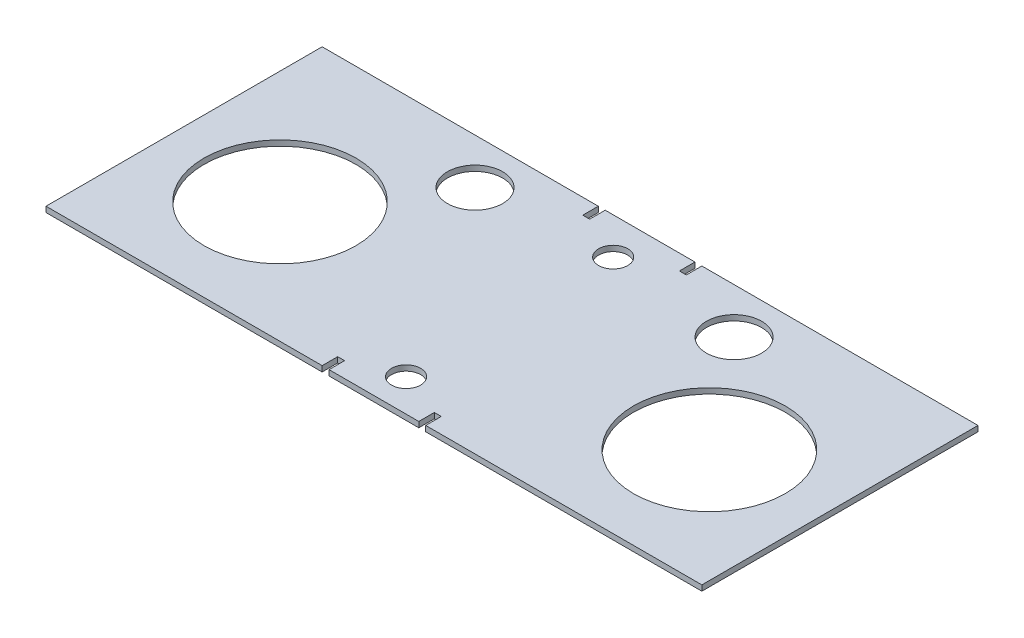
ISO-10303-21;
HEADER;
FILE_DESCRIPTION(('STEP AP214'),'2;1');
FILE_NAME('part.step','',(''),(''),'','','');
FILE_SCHEMA(('AUTOMOTIVE_DESIGN { 1 0 10303 214 1 1 1 1 }'));
ENDSEC;
DATA;
#1=APPLICATION_CONTEXT('core data for automotive mechanical design processes');
#2=APPLICATION_PROTOCOL_DEFINITION('international standard','automotive_design',2000,#1);
#3=PRODUCT_CONTEXT('',#1,'mechanical');
#4=PRODUCT('Part','Part','',(#3));
#5=PRODUCT_RELATED_PRODUCT_CATEGORY('part','',(#4));
#6=PRODUCT_DEFINITION_FORMATION('','',#4);
#7=PRODUCT_DEFINITION_CONTEXT('part definition',#1,'design');
#8=PRODUCT_DEFINITION('design','',#6,#7);
#9=PRODUCT_DEFINITION_SHAPE('','',#8);
#10=(LENGTH_UNIT() NAMED_UNIT(*) SI_UNIT(.MILLI.,.METRE.));
#11=(NAMED_UNIT(*) PLANE_ANGLE_UNIT() SI_UNIT($,.RADIAN.));
#12=(NAMED_UNIT(*) SI_UNIT($,.STERADIAN.) SOLID_ANGLE_UNIT());
#13=UNCERTAINTY_MEASURE_WITH_UNIT(LENGTH_MEASURE(1.E-05),#10,'distance_accuracy_value','');
#14=(GEOMETRIC_REPRESENTATION_CONTEXT(3) GLOBAL_UNCERTAINTY_ASSIGNED_CONTEXT((#13)) GLOBAL_UNIT_ASSIGNED_CONTEXT((#10,
#11,#12)) REPRESENTATION_CONTEXT('',''));
#15=CARTESIAN_POINT('',(0.,0.,0.));
#16=DIRECTION('',(0.,0.,1.));
#17=DIRECTION('',(1.,0.,0.));
#18=AXIS2_PLACEMENT_3D('',#15,#16,#17);
#19=CARTESIAN_POINT('',(0.,0.,0.));
#20=DIRECTION('',(0.,-1.,0.));
#21=DIRECTION('',(0.,0.,-1.));
#22=AXIS2_PLACEMENT_3D('',#19,#20,#21);
#23=PLANE('',#22);
#24=CARTESIAN_POINT('',(-0.0345900831630885,0.,-14.6910048312869));
#25=DIRECTION('',(0.,-1.,0.));
#26=DIRECTION('',(0.,0.,-1.));
#27=AXIS2_PLACEMENT_3D('',#24,#25,#26);
#28=CIRCLE('',#27,2.10819999999998);
#29=CARTESIAN_POINT('',(-0.0345900831630885,0.,-16.7992048312868));
#30=VERTEX_POINT('',#29);
#31=EDGE_CURVE('E315',#30,#30,#28,.T.);
#32=ORIENTED_EDGE('',*,*,#31,.T.);
#33=EDGE_LOOP('',(#32));
#34=FACE_BOUND('',#33,.T.);
#35=CARTESIAN_POINT('',(-0.0345900831630747,0.,15.3089951687131));
#36=DIRECTION('',(0.,-1.,0.));
#37=DIRECTION('',(0.,0.,-1.));
#38=AXIS2_PLACEMENT_3D('',#35,#36,#37);
#39=CIRCLE('',#38,2.10819999999998);
#40=CARTESIAN_POINT('',(-0.0345900831630747,0.,13.2007951687132));
#41=VERTEX_POINT('',#40);
#42=EDGE_CURVE('E321',#41,#41,#39,.T.);
#43=ORIENTED_EDGE('',*,*,#42,.T.);
#44=EDGE_LOOP('',(#43));
#45=FACE_BOUND('',#44,.T.);
#46=DIRECTION('',(0.,0.,-1.));
#47=VECTOR('',#46,1.);
#48=CARTESIAN_POINT('',(-6.5,0.,-17.75));
#49=LINE('',#48,#47);
#50=CARTESIAN_POINT('',(-6.5,0.,-17.75));
#51=VERTEX_POINT('',#50);
#52=CARTESIAN_POINT('',(-6.5,0.,-20.));
#53=VERTEX_POINT('',#52);
#54=EDGE_CURVE('E328',#51,#53,#49,.T.);
#55=ORIENTED_EDGE('',*,*,#54,.F.);
#56=DIRECTION('',(1.,0.,0.));
#57=VECTOR('',#56,1.);
#58=CARTESIAN_POINT('',(-7.59955742875643,0.,-17.75));
#59=LINE('',#58,#57);
#60=CARTESIAN_POINT('',(-7.5,0.,-17.75));
#61=VERTEX_POINT('',#60);
#62=EDGE_CURVE('E69',#61,#51,#59,.T.);
#63=ORIENTED_EDGE('',*,*,#62,.F.);
#64=DIRECTION('',(0.,0.,-1.));
#65=VECTOR('',#64,1.);
#66=CARTESIAN_POINT('',(-7.5,0.,0.));
#67=LINE('',#66,#65);
#68=CARTESIAN_POINT('',(-7.5,0.,-20.));
#69=VERTEX_POINT('',#68);
#70=EDGE_CURVE('E291',#69,#61,#67,.F.);
#71=ORIENTED_EDGE('',*,*,#70,.F.);
#72=DIRECTION('',(1.,0.,0.));
#73=VECTOR('',#72,1.);
#74=CARTESIAN_POINT('',(-7.59955742875643,0.,-20.));
#75=LINE('',#74,#73);
#76=CARTESIAN_POINT('',(-47.5,0.,-20.));
#77=VERTEX_POINT('',#76);
#78=EDGE_CURVE('E294',#77,#69,#75,.T.);
#79=ORIENTED_EDGE('',*,*,#78,.F.);
#80=DIRECTION('',(0.,0.,1.));
#81=VECTOR('',#80,1.);
#82=CARTESIAN_POINT('',(-47.5,0.,20.));
#83=LINE('',#82,#81);
#84=CARTESIAN_POINT('',(-47.5,0.,20.));
#85=VERTEX_POINT('',#84);
#86=EDGE_CURVE('E253',#77,#85,#83,.T.);
#87=ORIENTED_EDGE('',*,*,#86,.T.);
#88=DIRECTION('',(1.,0.,0.));
#89=VECTOR('',#88,1.);
#90=CARTESIAN_POINT('',(-7.59955742875643,0.,20.));
#91=LINE('',#90,#89);
#92=CARTESIAN_POINT('',(-7.5,0.,20.));
#93=VERTEX_POINT('',#92);
#94=EDGE_CURVE('E297',#93,#85,#91,.F.);
#95=ORIENTED_EDGE('',*,*,#94,.F.);
#96=DIRECTION('',(0.,0.,-1.));
#97=VECTOR('',#96,1.);
#98=CARTESIAN_POINT('',(-7.5,0.,0.));
#99=LINE('',#98,#97);
#100=CARTESIAN_POINT('',(-7.5,0.,17.75));
#101=VERTEX_POINT('',#100);
#102=EDGE_CURVE('E299',#101,#93,#99,.F.);
#103=ORIENTED_EDGE('',*,*,#102,.F.);
#104=DIRECTION('',(1.,0.,0.));
#105=VECTOR('',#104,1.);
#106=CARTESIAN_POINT('',(-7.59955742875643,0.,17.75));
#107=LINE('',#106,#105);
#108=CARTESIAN_POINT('',(-6.5,0.,17.75));
#109=VERTEX_POINT('',#108);
#110=EDGE_CURVE('E252',#109,#101,#107,.F.);
#111=ORIENTED_EDGE('',*,*,#110,.F.);
#112=DIRECTION('',(0.,0.,1.));
#113=VECTOR('',#112,1.);
#114=CARTESIAN_POINT('',(-6.5,0.,0.));
#115=LINE('',#114,#113);
#116=CARTESIAN_POINT('',(-6.5,0.,20.));
#117=VERTEX_POINT('',#116);
#118=EDGE_CURVE('E353',#109,#117,#115,.T.);
#119=ORIENTED_EDGE('',*,*,#118,.T.);
#120=DIRECTION('',(1.,0.,0.));
#121=VECTOR('',#120,1.);
#122=CARTESIAN_POINT('',(-47.5,0.,20.));
#123=LINE('',#122,#121);
#124=CARTESIAN_POINT('',(6.50000000000001,0.,20.));
#125=VERTEX_POINT('',#124);
#126=EDGE_CURVE('E361',#117,#125,#123,.T.);
#127=ORIENTED_EDGE('',*,*,#126,.T.);
#128=DIRECTION('',(0.,0.,1.));
#129=VECTOR('',#128,1.);
#130=CARTESIAN_POINT('',(6.50000000000001,0.,22.25));
#131=LINE('',#130,#129);
#132=CARTESIAN_POINT('',(6.50000000000001,0.,17.75));
#133=VERTEX_POINT('',#132);
#134=EDGE_CURVE('E335',#133,#125,#131,.T.);
#135=ORIENTED_EDGE('',*,*,#134,.F.);
#136=DIRECTION('',(1.,0.,0.));
#137=VECTOR('',#136,1.);
#138=CARTESIAN_POINT('',(7.59955742875644,0.,17.75));
#139=LINE('',#138,#137);
#140=CARTESIAN_POINT('',(7.50000000000001,0.,17.75));
#141=VERTEX_POINT('',#140);
#142=EDGE_CURVE('E61',#141,#133,#139,.F.);
#143=ORIENTED_EDGE('',*,*,#142,.F.);
#144=DIRECTION('',(0.,0.,-1.));
#145=VECTOR('',#144,1.);
#146=CARTESIAN_POINT('',(7.50000000000001,0.,0.));
#147=LINE('',#146,#145);
#148=CARTESIAN_POINT('',(7.50000000000001,0.,20.));
#149=VERTEX_POINT('',#148);
#150=EDGE_CURVE('E229',#149,#141,#147,.T.);
#151=ORIENTED_EDGE('',*,*,#150,.F.);
#152=DIRECTION('',(1.,0.,0.));
#153=VECTOR('',#152,1.);
#154=CARTESIAN_POINT('',(7.59955742875644,0.,20.));
#155=LINE('',#154,#153);
#156=CARTESIAN_POINT('',(47.5,0.,20.));
#157=VERTEX_POINT('',#156);
#158=EDGE_CURVE('E232',#157,#149,#155,.F.);
#159=ORIENTED_EDGE('',*,*,#158,.F.);
#160=DIRECTION('',(0.,0.,-1.));
#161=VECTOR('',#160,1.);
#162=CARTESIAN_POINT('',(47.5,0.,20.));
#163=LINE('',#162,#161);
#164=CARTESIAN_POINT('',(47.5,0.,-20.));
#165=VERTEX_POINT('',#164);
#166=EDGE_CURVE('E203',#157,#165,#163,.T.);
#167=ORIENTED_EDGE('',*,*,#166,.T.);
#168=DIRECTION('',(1.,0.,0.));
#169=VECTOR('',#168,1.);
#170=CARTESIAN_POINT('',(7.59955742875644,0.,-20.));
#171=LINE('',#170,#169);
#172=CARTESIAN_POINT('',(7.5,0.,-20.));
#173=VERTEX_POINT('',#172);
#174=EDGE_CURVE('E234',#173,#165,#171,.T.);
#175=ORIENTED_EDGE('',*,*,#174,.F.);
#176=DIRECTION('',(0.,0.,-1.));
#177=VECTOR('',#176,1.);
#178=CARTESIAN_POINT('',(7.5,0.,0.));
#179=LINE('',#178,#177);
#180=CARTESIAN_POINT('',(7.5,0.,-17.75));
#181=VERTEX_POINT('',#180);
#182=EDGE_CURVE('E236',#181,#173,#179,.T.);
#183=ORIENTED_EDGE('',*,*,#182,.F.);
#184=DIRECTION('',(1.,0.,0.));
#185=VECTOR('',#184,1.);
#186=CARTESIAN_POINT('',(7.59955742875644,0.,-17.75));
#187=LINE('',#186,#185);
#188=CARTESIAN_POINT('',(6.50000000000001,0.,-17.75));
#189=VERTEX_POINT('',#188);
#190=EDGE_CURVE('E204',#189,#181,#187,.T.);
#191=ORIENTED_EDGE('',*,*,#190,.F.);
#192=DIRECTION('',(0.,0.,-1.));
#193=VECTOR('',#192,1.);
#194=CARTESIAN_POINT('',(6.5,0.,0.));
#195=LINE('',#194,#193);
#196=CARTESIAN_POINT('',(6.5,0.,-20.));
#197=VERTEX_POINT('',#196);
#198=EDGE_CURVE('E350',#189,#197,#195,.T.);
#199=ORIENTED_EDGE('',*,*,#198,.T.);
#200=DIRECTION('',(-1.,0.,0.));
#201=VECTOR('',#200,1.);
#202=CARTESIAN_POINT('',(-47.5,0.,-20.));
#203=LINE('',#202,#201);
#204=EDGE_CURVE('E349',#197,#53,#203,.T.);
#205=ORIENTED_EDGE('',*,*,#204,.T.);
#206=EDGE_LOOP('',(#55,#63,#71,#79,#87,#95,#103,#111,#119,#127,#135,#143,#151,#159,#167,#175,
#183,#191,#199,#205));
#207=FACE_BOUND('',#206,.T.);
#208=CARTESIAN_POINT('',(-31.0972644046002,0.,2.50699135743875));
#209=DIRECTION('',(0.,-1.,0.));
#210=DIRECTION('',(1.,0.,0.));
#211=AXIS2_PLACEMENT_3D('',#208,#209,#210);
#212=CIRCLE('',#211,11.);
#213=CARTESIAN_POINT('',(-20.0972644046002,0.,2.50699135743875));
#214=VERTEX_POINT('',#213);
#215=EDGE_CURVE('E259',#214,#214,#212,.T.);
#216=ORIENTED_EDGE('',*,*,#215,.T.);
#217=EDGE_LOOP('',(#216));
#218=FACE_BOUND('',#217,.T.);
#219=CARTESIAN_POINT('',(-18.7592276804298,0.,-13.4035690974526));
#220=DIRECTION('',(0.,-1.,0.));
#221=DIRECTION('',(1.,0.,0.));
#222=AXIS2_PLACEMENT_3D('',#219,#220,#221);
#223=CIRCLE('',#222,3.99999999999999);
#224=CARTESIAN_POINT('',(-14.7592276804298,0.,-13.4035690974526));
#225=VERTEX_POINT('',#224);
#226=EDGE_CURVE('E256',#225,#225,#223,.T.);
#227=ORIENTED_EDGE('',*,*,#226,.T.);
#228=EDGE_LOOP('',(#227));
#229=FACE_BOUND('',#228,.T.);
#230=CARTESIAN_POINT('',(31.0972644046002,0.,2.50699135743875));
#231=DIRECTION('',(0.,-1.,0.));
#232=DIRECTION('',(1.,0.,0.));
#233=AXIS2_PLACEMENT_3D('',#230,#231,#232);
#234=CIRCLE('',#233,11.);
#235=CARTESIAN_POINT('',(42.0972644046002,0.,2.50699135743875));
#236=VERTEX_POINT('',#235);
#237=EDGE_CURVE('E431',#236,#236,#234,.T.);
#238=ORIENTED_EDGE('',*,*,#237,.T.);
#239=EDGE_LOOP('',(#238));
#240=FACE_BOUND('',#239,.T.);
#241=CARTESIAN_POINT('',(18.7592276804298,0.,-13.4035690974526));
#242=DIRECTION('',(0.,-1.,0.));
#243=DIRECTION('',(1.,0.,0.));
#244=AXIS2_PLACEMENT_3D('',#241,#242,#243);
#245=CIRCLE('',#244,3.99999999999999);
#246=CARTESIAN_POINT('',(22.7592276804298,0.,-13.4035690974526));
#247=VERTEX_POINT('',#246);
#248=EDGE_CURVE('E428',#247,#247,#245,.T.);
#249=ORIENTED_EDGE('',*,*,#248,.T.);
#250=EDGE_LOOP('',(#249));
#251=FACE_BOUND('',#250,.T.);
#252=ADVANCED_FACE('F47',(#34,#45,#207,#218,#229,#240,#251),#23,.F.);
#253=CARTESIAN_POINT('',(0.,-0.8,0.));
#254=DIRECTION('',(0.,-1.,0.));
#255=DIRECTION('',(0.,0.,-1.));
#256=AXIS2_PLACEMENT_3D('',#253,#254,#255);
#257=PLANE('',#256);
#258=CARTESIAN_POINT('',(-0.0345900831630885,-0.8,-14.6910048312869));
#259=DIRECTION('',(0.,-1.,0.));
#260=DIRECTION('',(0.,0.,-1.));
#261=AXIS2_PLACEMENT_3D('',#258,#259,#260);
#262=CIRCLE('',#261,2.10819999999999);
#263=CARTESIAN_POINT('',(-0.0345900831630885,-0.8,-16.7992048312868));
#264=VERTEX_POINT('',#263);
#265=EDGE_CURVE('E311',#264,#264,#262,.T.);
#266=ORIENTED_EDGE('',*,*,#265,.F.);
#267=EDGE_LOOP('',(#266));
#268=FACE_BOUND('',#267,.T.);
#269=CARTESIAN_POINT('',(-0.0345900831630747,-0.8,15.3089951687131));
#270=DIRECTION('',(0.,-1.,0.));
#271=DIRECTION('',(0.,0.,-1.));
#272=AXIS2_PLACEMENT_3D('',#269,#270,#271);
#273=CIRCLE('',#272,2.10819999999999);
#274=CARTESIAN_POINT('',(-0.0345900831630747,-0.8,13.2007951687132));
#275=VERTEX_POINT('',#274);
#276=EDGE_CURVE('E318',#275,#275,#273,.T.);
#277=ORIENTED_EDGE('',*,*,#276,.F.);
#278=EDGE_LOOP('',(#277));
#279=FACE_BOUND('',#278,.T.);
#280=DIRECTION('',(0.,0.,-1.));
#281=VECTOR('',#280,1.);
#282=CARTESIAN_POINT('',(-6.5,-0.8,22.25));
#283=LINE('',#282,#281);
#284=CARTESIAN_POINT('',(-6.5,-0.8,20.));
#285=VERTEX_POINT('',#284);
#286=CARTESIAN_POINT('',(-6.5,-0.8,17.75));
#287=VERTEX_POINT('',#286);
#288=EDGE_CURVE('E324',#285,#287,#283,.T.);
#289=ORIENTED_EDGE('',*,*,#288,.T.);
#290=DIRECTION('',(1.,0.,0.));
#291=VECTOR('',#290,1.);
#292=CARTESIAN_POINT('',(-7.59955742875643,-0.8,17.75));
#293=LINE('',#292,#291);
#294=CARTESIAN_POINT('',(-7.5,-0.8,17.75));
#295=VERTEX_POINT('',#294);
#296=EDGE_CURVE('E285',#287,#295,#293,.F.);
#297=ORIENTED_EDGE('',*,*,#296,.T.);
#298=DIRECTION('',(0.,0.,-1.));
#299=VECTOR('',#298,1.);
#300=CARTESIAN_POINT('',(-7.5,-0.8,0.));
#301=LINE('',#300,#299);
#302=CARTESIAN_POINT('',(-7.5,-0.8,20.));
#303=VERTEX_POINT('',#302);
#304=EDGE_CURVE('E282',#295,#303,#301,.F.);
#305=ORIENTED_EDGE('',*,*,#304,.T.);
#306=DIRECTION('',(1.,0.,0.));
#307=VECTOR('',#306,1.);
#308=CARTESIAN_POINT('',(-7.59955742875643,-0.8,20.));
#309=LINE('',#308,#307);
#310=CARTESIAN_POINT('',(-47.5,-0.8,20.));
#311=VERTEX_POINT('',#310);
#312=EDGE_CURVE('E280',#303,#311,#309,.F.);
#313=ORIENTED_EDGE('',*,*,#312,.T.);
#314=DIRECTION('',(0.,0.,1.));
#315=VECTOR('',#314,1.);
#316=CARTESIAN_POINT('',(-47.5,-0.8,20.));
#317=LINE('',#316,#315);
#318=CARTESIAN_POINT('',(-47.5,-0.8,-20.));
#319=VERTEX_POINT('',#318);
#320=EDGE_CURVE('E247',#319,#311,#317,.T.);
#321=ORIENTED_EDGE('',*,*,#320,.F.);
#322=DIRECTION('',(1.,0.,0.));
#323=VECTOR('',#322,1.);
#324=CARTESIAN_POINT('',(-7.59955742875643,-0.8,-20.));
#325=LINE('',#324,#323);
#326=CARTESIAN_POINT('',(-7.5,-0.8,-20.));
#327=VERTEX_POINT('',#326);
#328=EDGE_CURVE('E277',#319,#327,#325,.T.);
#329=ORIENTED_EDGE('',*,*,#328,.T.);
#330=DIRECTION('',(0.,0.,-1.));
#331=VECTOR('',#330,1.);
#332=CARTESIAN_POINT('',(-7.5,-0.8,0.));
#333=LINE('',#332,#331);
#334=CARTESIAN_POINT('',(-7.5,-0.8,-17.75));
#335=VERTEX_POINT('',#334);
#336=EDGE_CURVE('E273',#327,#335,#333,.F.);
#337=ORIENTED_EDGE('',*,*,#336,.T.);
#338=DIRECTION('',(1.,0.,0.));
#339=VECTOR('',#338,1.);
#340=CARTESIAN_POINT('',(-7.59955742875643,-0.8,-17.75));
#341=LINE('',#340,#339);
#342=CARTESIAN_POINT('',(-6.5,-0.8,-17.75));
#343=VERTEX_POINT('',#342);
#344=EDGE_CURVE('E276',#335,#343,#341,.T.);
#345=ORIENTED_EDGE('',*,*,#344,.T.);
#346=DIRECTION('',(0.,0.,-1.));
#347=VECTOR('',#346,1.);
#348=CARTESIAN_POINT('',(-6.5,-0.8,-17.75));
#349=LINE('',#348,#347);
#350=CARTESIAN_POINT('',(-6.5,-0.8,-20.));
#351=VERTEX_POINT('',#350);
#352=EDGE_CURVE('E329',#343,#351,#349,.T.);
#353=ORIENTED_EDGE('',*,*,#352,.T.);
#354=DIRECTION('',(-1.,0.,0.));
#355=VECTOR('',#354,1.);
#356=CARTESIAN_POINT('',(-47.5,-0.8,-20.));
#357=LINE('',#356,#355);
#358=CARTESIAN_POINT('',(6.5,-0.8,-20.));
#359=VERTEX_POINT('',#358);
#360=EDGE_CURVE('E358',#359,#351,#357,.T.);
#361=ORIENTED_EDGE('',*,*,#360,.F.);
#362=DIRECTION('',(0.,0.,1.));
#363=VECTOR('',#362,1.);
#364=CARTESIAN_POINT('',(6.5,-0.8,-22.25));
#365=LINE('',#364,#363);
#366=CARTESIAN_POINT('',(6.50000000000001,-0.8,-17.75));
#367=VERTEX_POINT('',#366);
#368=EDGE_CURVE('E344',#359,#367,#365,.T.);
#369=ORIENTED_EDGE('',*,*,#368,.T.);
#370=DIRECTION('',(1.,0.,0.));
#371=VECTOR('',#370,1.);
#372=CARTESIAN_POINT('',(7.59955742875644,-0.8,-17.75));
#373=LINE('',#372,#371);
#374=CARTESIAN_POINT('',(7.5,-0.8,-17.75));
#375=VERTEX_POINT('',#374);
#376=EDGE_CURVE('E223',#367,#375,#373,.T.);
#377=ORIENTED_EDGE('',*,*,#376,.T.);
#378=DIRECTION('',(0.,0.,-1.));
#379=VECTOR('',#378,1.);
#380=CARTESIAN_POINT('',(7.5,-0.8,0.));
#381=LINE('',#380,#379);
#382=CARTESIAN_POINT('',(7.5,-0.8,-20.));
#383=VERTEX_POINT('',#382);
#384=EDGE_CURVE('E221',#375,#383,#381,.T.);
#385=ORIENTED_EDGE('',*,*,#384,.T.);
#386=DIRECTION('',(1.,0.,0.));
#387=VECTOR('',#386,1.);
#388=CARTESIAN_POINT('',(7.59955742875644,-0.8,-20.));
#389=LINE('',#388,#387);
#390=CARTESIAN_POINT('',(47.5,-0.799999999999999,-20.));
#391=VERTEX_POINT('',#390);
#392=EDGE_CURVE('E195',#383,#391,#389,.T.);
#393=ORIENTED_EDGE('',*,*,#392,.T.);
#394=DIRECTION('',(0.,0.,-1.));
#395=VECTOR('',#394,1.);
#396=CARTESIAN_POINT('',(47.5,-0.799999999999999,20.));
#397=LINE('',#396,#395);
#398=CARTESIAN_POINT('',(47.5,-0.799999999999999,20.));
#399=VERTEX_POINT('',#398);
#400=EDGE_CURVE('E201',#399,#391,#397,.T.);
#401=ORIENTED_EDGE('',*,*,#400,.F.);
#402=DIRECTION('',(1.,0.,0.));
#403=VECTOR('',#402,1.);
#404=CARTESIAN_POINT('',(7.59955742875644,-0.8,20.));
#405=LINE('',#404,#403);
#406=CARTESIAN_POINT('',(7.50000000000001,-0.8,20.));
#407=VERTEX_POINT('',#406);
#408=EDGE_CURVE('E183',#399,#407,#405,.F.);
#409=ORIENTED_EDGE('',*,*,#408,.T.);
#410=DIRECTION('',(0.,0.,-1.));
#411=VECTOR('',#410,1.);
#412=CARTESIAN_POINT('',(7.50000000000001,-0.8,0.));
#413=LINE('',#412,#411);
#414=CARTESIAN_POINT('',(7.50000000000001,-0.8,17.75));
#415=VERTEX_POINT('',#414);
#416=EDGE_CURVE('E194',#407,#415,#413,.T.);
#417=ORIENTED_EDGE('',*,*,#416,.T.);
#418=DIRECTION('',(1.,0.,0.));
#419=VECTOR('',#418,1.);
#420=CARTESIAN_POINT('',(7.59955742875644,-0.8,17.75));
#421=LINE('',#420,#419);
#422=CARTESIAN_POINT('',(6.50000000000001,-0.8,17.75));
#423=VERTEX_POINT('',#422);
#424=EDGE_CURVE('E218',#415,#423,#421,.F.);
#425=ORIENTED_EDGE('',*,*,#424,.T.);
#426=DIRECTION('',(0.,0.,1.));
#427=VECTOR('',#426,1.);
#428=CARTESIAN_POINT('',(6.50000000000001,-0.8,22.25));
#429=LINE('',#428,#427);
#430=CARTESIAN_POINT('',(6.50000000000001,-0.8,20.));
#431=VERTEX_POINT('',#430);
#432=EDGE_CURVE('E336',#423,#431,#429,.T.);
#433=ORIENTED_EDGE('',*,*,#432,.T.);
#434=DIRECTION('',(1.,0.,0.));
#435=VECTOR('',#434,1.);
#436=CARTESIAN_POINT('',(-47.5,-0.8,20.));
#437=LINE('',#436,#435);
#438=EDGE_CURVE('E354',#285,#431,#437,.T.);
#439=ORIENTED_EDGE('',*,*,#438,.F.);
#440=EDGE_LOOP('',(#289,#297,#305,#313,#321,#329,#337,#345,#353,#361,#369,#377,#385,#393,#401,
#409,#417,#425,#433,#439));
#441=FACE_BOUND('',#440,.T.);
#442=CARTESIAN_POINT('',(-31.0972644046002,-0.80000000000017,2.50699135743875));
#443=DIRECTION('',(0.,1.,0.));
#444=DIRECTION('',(0.,0.,-1.));
#445=AXIS2_PLACEMENT_3D('',#442,#443,#444);
#446=CIRCLE('',#445,11.);
#447=CARTESIAN_POINT('',(-31.0972644046002,-0.800000000000172,-8.49300864256123));
#448=VERTEX_POINT('',#447);
#449=EDGE_CURVE('E262',#448,#448,#446,.T.);
#450=ORIENTED_EDGE('',*,*,#449,.T.);
#451=EDGE_LOOP('',(#450));
#452=FACE_BOUND('',#451,.T.);
#453=CARTESIAN_POINT('',(-18.7592276804298,-0.8,-13.4035690974526));
#454=DIRECTION('',(0.,-1.,0.));
#455=DIRECTION('',(0.,0.,1.));
#456=AXIS2_PLACEMENT_3D('',#453,#454,#455);
#457=CIRCLE('',#456,3.99999999999999);
#458=CARTESIAN_POINT('',(-18.7592276804298,-0.8,-9.4035690974526));
#459=VERTEX_POINT('',#458);
#460=EDGE_CURVE('E265',#459,#459,#457,.T.);
#461=ORIENTED_EDGE('',*,*,#460,.F.);
#462=EDGE_LOOP('',(#461));
#463=FACE_BOUND('',#462,.T.);
#464=CARTESIAN_POINT('',(31.0972644046002,-0.799999999999999,2.50699135743875));
#465=DIRECTION('',(0.,-1.,0.));
#466=DIRECTION('',(0.,0.,-1.));
#467=AXIS2_PLACEMENT_3D('',#464,#465,#466);
#468=CIRCLE('',#467,11.);
#469=CARTESIAN_POINT('',(31.0972644046002,-0.799999999999999,-8.49300864256124));
#470=VERTEX_POINT('',#469);
#471=EDGE_CURVE('E214',#470,#470,#468,.T.);
#472=ORIENTED_EDGE('',*,*,#471,.F.);
#473=EDGE_LOOP('',(#472));
#474=FACE_BOUND('',#473,.T.);
#475=CARTESIAN_POINT('',(18.7592276804298,-0.800000000000085,-13.4035690974526));
#476=DIRECTION('',(0.,1.,0.));
#477=DIRECTION('',(0.,0.,1.));
#478=AXIS2_PLACEMENT_3D('',#475,#476,#477);
#479=CIRCLE('',#478,3.99999999999998);
#480=CARTESIAN_POINT('',(18.7592276804298,-0.800000000000084,-9.4035690974526));
#481=VERTEX_POINT('',#480);
#482=EDGE_CURVE('E436',#481,#481,#479,.T.);
#483=ORIENTED_EDGE('',*,*,#482,.T.);
#484=EDGE_LOOP('',(#483));
#485=FACE_BOUND('',#484,.T.);
#486=ADVANCED_FACE('F207',(#268,#279,#441,#452,#463,#474,#485),#257,.T.);
#487=CARTESIAN_POINT('',(-47.5,-0.8,20.));
#488=DIRECTION('',(0.,0.,1.));
#489=DIRECTION('',(1.,0.,0.));
#490=AXIS2_PLACEMENT_3D('',#487,#488,#489);
#491=PLANE('',#490);
#492=DIRECTION('',(0.,1.,0.));
#493=VECTOR('',#492,1.);
#494=CARTESIAN_POINT('',(-6.5,-0.8,20.));
#495=LINE('',#494,#493);
#496=EDGE_CURVE('E326',#285,#117,#495,.T.);
#497=ORIENTED_EDGE('',*,*,#496,.F.);
#498=ORIENTED_EDGE('',*,*,#438,.T.);
#499=DIRECTION('',(0.,-1.,0.));
#500=VECTOR('',#499,1.);
#501=CARTESIAN_POINT('',(6.50000000000001,-0.8,20.));
#502=LINE('',#501,#500);
#503=EDGE_CURVE('E339',#125,#431,#502,.T.);
#504=ORIENTED_EDGE('',*,*,#503,.F.);
#505=ORIENTED_EDGE('',*,*,#126,.F.);
#506=EDGE_LOOP('',(#497,#498,#504,#505));
#507=FACE_BOUND('',#506,.T.);
#508=ADVANCED_FACE('F419',(#507),#491,.T.);
#509=CARTESIAN_POINT('',(-47.5,-0.8,-20.));
#510=DIRECTION('',(0.,0.,-1.));
#511=DIRECTION('',(-1.,0.,0.));
#512=AXIS2_PLACEMENT_3D('',#509,#510,#511);
#513=PLANE('',#512);
#514=DIRECTION('',(0.,-1.,0.));
#515=VECTOR('',#514,1.);
#516=CARTESIAN_POINT('',(-6.5,-0.8,-20.));
#517=LINE('',#516,#515);
#518=EDGE_CURVE('E332',#53,#351,#517,.T.);
#519=ORIENTED_EDGE('',*,*,#518,.F.);
#520=ORIENTED_EDGE('',*,*,#204,.F.);
#521=DIRECTION('',(0.,1.,0.));
#522=VECTOR('',#521,1.);
#523=CARTESIAN_POINT('',(6.5,-0.8,-20.));
#524=LINE('',#523,#522);
#525=EDGE_CURVE('E347',#359,#197,#524,.T.);
#526=ORIENTED_EDGE('',*,*,#525,.F.);
#527=ORIENTED_EDGE('',*,*,#360,.T.);
#528=EDGE_LOOP('',(#519,#520,#526,#527));
#529=FACE_BOUND('',#528,.T.);
#530=ADVANCED_FACE('F385',(#529),#513,.T.);
#531=CARTESIAN_POINT('',(6.5,-0.8,-22.25));
#532=DIRECTION('',(-1.,0.,0.));
#533=DIRECTION('',(0.,0.,1.));
#534=AXIS2_PLACEMENT_3D('',#531,#532,#533);
#535=PLANE('',#534);
#536=ORIENTED_EDGE('',*,*,#525,.T.);
#537=ORIENTED_EDGE('',*,*,#198,.F.);
#538=DIRECTION('',(0.,1.,0.));
#539=VECTOR('',#538,1.);
#540=CARTESIAN_POINT('',(6.5,-0.8,-17.75));
#541=LINE('',#540,#539);
#542=EDGE_CURVE('E54',#367,#189,#541,.T.);
#543=ORIENTED_EDGE('',*,*,#542,.F.);
#544=ORIENTED_EDGE('',*,*,#368,.F.);
#545=EDGE_LOOP('',(#536,#537,#543,#544));
#546=FACE_BOUND('',#545,.T.);
#547=ADVANCED_FACE('F380',(#546),#535,.F.);
#548=CARTESIAN_POINT('',(6.50000000000001,-0.8,22.25));
#549=DIRECTION('',(-1.,0.,0.));
#550=DIRECTION('',(0.,0.,1.));
#551=AXIS2_PLACEMENT_3D('',#548,#549,#550);
#552=PLANE('',#551);
#553=ORIENTED_EDGE('',*,*,#503,.T.);
#554=ORIENTED_EDGE('',*,*,#432,.F.);
#555=DIRECTION('',(0.,1.,0.));
#556=VECTOR('',#555,1.);
#557=CARTESIAN_POINT('',(6.50000000000001,-0.8,17.75));
#558=LINE('',#557,#556);
#559=EDGE_CURVE('E12',#423,#133,#558,.T.);
#560=ORIENTED_EDGE('',*,*,#559,.T.);
#561=ORIENTED_EDGE('',*,*,#134,.T.);
#562=EDGE_LOOP('',(#553,#554,#560,#561));
#563=FACE_BOUND('',#562,.T.);
#564=ADVANCED_FACE('F422',(#563),#552,.F.);
#565=CARTESIAN_POINT('',(-6.5,-0.8,-17.75));
#566=DIRECTION('',(1.,0.,0.));
#567=DIRECTION('',(0.,0.,-1.));
#568=AXIS2_PLACEMENT_3D('',#565,#566,#567);
#569=PLANE('',#568);
#570=ORIENTED_EDGE('',*,*,#518,.T.);
#571=ORIENTED_EDGE('',*,*,#352,.F.);
#572=DIRECTION('',(0.,1.,0.));
#573=VECTOR('',#572,1.);
#574=CARTESIAN_POINT('',(-6.5,-0.8,-17.75));
#575=LINE('',#574,#573);
#576=EDGE_CURVE('E367',#343,#51,#575,.T.);
#577=ORIENTED_EDGE('',*,*,#576,.T.);
#578=ORIENTED_EDGE('',*,*,#54,.T.);
#579=EDGE_LOOP('',(#570,#571,#577,#578));
#580=FACE_BOUND('',#579,.T.);
#581=ADVANCED_FACE('F389',(#580),#569,.F.);
#582=CARTESIAN_POINT('',(-6.5,-0.8,22.25));
#583=DIRECTION('',(1.,0.,0.));
#584=DIRECTION('',(0.,0.,-1.));
#585=AXIS2_PLACEMENT_3D('',#582,#583,#584);
#586=PLANE('',#585);
#587=ORIENTED_EDGE('',*,*,#496,.T.);
#588=ORIENTED_EDGE('',*,*,#118,.F.);
#589=DIRECTION('',(0.,1.,0.));
#590=VECTOR('',#589,1.);
#591=CARTESIAN_POINT('',(-6.5,-0.8,17.75));
#592=LINE('',#591,#590);
#593=EDGE_CURVE('E357',#287,#109,#592,.T.);
#594=ORIENTED_EDGE('',*,*,#593,.F.);
#595=ORIENTED_EDGE('',*,*,#288,.F.);
#596=EDGE_LOOP('',(#587,#588,#594,#595));
#597=FACE_BOUND('',#596,.T.);
#598=ADVANCED_FACE('F415',(#597),#586,.F.);
#599=CARTESIAN_POINT('',(-0.0345900831630747,-0.8,15.3089951687131));
#600=DIRECTION('',(0.,-1.,0.));
#601=DIRECTION('',(0.,0.,-1.));
#602=AXIS2_PLACEMENT_3D('',#599,#600,#601);
#603=CYLINDRICAL_SURFACE('',#602,2.10819999999998);
#604=ORIENTED_EDGE('',*,*,#276,.T.);
#605=EDGE_LOOP('',(#604));
#606=FACE_BOUND('',#605,.T.);
#607=ORIENTED_EDGE('',*,*,#42,.F.);
#608=EDGE_LOOP('',(#607));
#609=FACE_BOUND('',#608,.T.);
#610=ADVANCED_FACE('F465',(#606,#609),#603,.F.);
#611=CARTESIAN_POINT('',(-0.0345900831630885,-0.8,-14.6910048312869));
#612=DIRECTION('',(0.,-1.,0.));
#613=DIRECTION('',(0.,0.,-1.));
#614=AXIS2_PLACEMENT_3D('',#611,#612,#613);
#615=CYLINDRICAL_SURFACE('',#614,2.10819999999998);
#616=ORIENTED_EDGE('',*,*,#265,.T.);
#617=EDGE_LOOP('',(#616));
#618=FACE_BOUND('',#617,.T.);
#619=ORIENTED_EDGE('',*,*,#31,.F.);
#620=EDGE_LOOP('',(#619));
#621=FACE_BOUND('',#620,.T.);
#622=ADVANCED_FACE('F467',(#618,#621),#615,.F.);
#623=CARTESIAN_POINT('',(-7.59955742875643,-0.4,17.75));
#624=DIRECTION('',(0.,0.,-1.));
#625=DIRECTION('',(1.,0.,0.));
#626=AXIS2_PLACEMENT_3D('',#623,#624,#625);
#627=PLANE('',#626);
#628=ORIENTED_EDGE('',*,*,#593,.T.);
#629=ORIENTED_EDGE('',*,*,#110,.T.);
#630=DIRECTION('',(0.,-1.,0.));
#631=VECTOR('',#630,1.);
#632=CARTESIAN_POINT('',(-7.5,-0.4,17.75));
#633=LINE('',#632,#631);
#634=EDGE_CURVE('E309',#101,#295,#633,.T.);
#635=ORIENTED_EDGE('',*,*,#634,.T.);
#636=ORIENTED_EDGE('',*,*,#296,.F.);
#637=EDGE_LOOP('',(#628,#629,#635,#636));
#638=FACE_BOUND('',#637,.T.);
#639=ADVANCED_FACE('F408',(#638),#627,.F.);
#640=CARTESIAN_POINT('',(-7.5,-0.4,0.));
#641=DIRECTION('',(-1.,0.,0.));
#642=DIRECTION('',(0.,0.,-1.));
#643=AXIS2_PLACEMENT_3D('',#640,#641,#642);
#644=PLANE('',#643);
#645=ORIENTED_EDGE('',*,*,#634,.F.);
#646=ORIENTED_EDGE('',*,*,#102,.T.);
#647=DIRECTION('',(0.,-1.,0.));
#648=VECTOR('',#647,1.);
#649=CARTESIAN_POINT('',(-7.5,-0.4,20.));
#650=LINE('',#649,#648);
#651=EDGE_CURVE('E307',#93,#303,#650,.T.);
#652=ORIENTED_EDGE('',*,*,#651,.T.);
#653=ORIENTED_EDGE('',*,*,#304,.F.);
#654=EDGE_LOOP('',(#645,#646,#652,#653));
#655=FACE_BOUND('',#654,.T.);
#656=ADVANCED_FACE('F405',(#655),#644,.F.);
#657=CARTESIAN_POINT('',(-7.59955742875643,-0.4,20.));
#658=DIRECTION('',(0.,0.,-1.));
#659=DIRECTION('',(1.,0.,0.));
#660=AXIS2_PLACEMENT_3D('',#657,#658,#659);
#661=PLANE('',#660);
#662=ORIENTED_EDGE('',*,*,#651,.F.);
#663=ORIENTED_EDGE('',*,*,#94,.T.);
#664=DIRECTION('',(0.,1.,0.));
#665=VECTOR('',#664,1.);
#666=CARTESIAN_POINT('',(-47.5,-0.8,20.));
#667=LINE('',#666,#665);
#668=EDGE_CURVE('E268',#311,#85,#667,.T.);
#669=ORIENTED_EDGE('',*,*,#668,.F.);
#670=ORIENTED_EDGE('',*,*,#312,.F.);
#671=EDGE_LOOP('',(#662,#663,#669,#670));
#672=FACE_BOUND('',#671,.T.);
#673=ADVANCED_FACE('F536',(#672),#661,.F.);
#674=CARTESIAN_POINT('',(-7.59955742875643,-0.4,-20.));
#675=DIRECTION('',(0.,0.,-1.));
#676=DIRECTION('',(1.,0.,0.));
#677=AXIS2_PLACEMENT_3D('',#674,#675,#676);
#678=PLANE('',#677);
#679=ORIENTED_EDGE('',*,*,#328,.F.);
#680=DIRECTION('',(0.,1.,0.));
#681=VECTOR('',#680,1.);
#682=CARTESIAN_POINT('',(-47.5,-0.8,-20.));
#683=LINE('',#682,#681);
#684=EDGE_CURVE('E249',#319,#77,#683,.T.);
#685=ORIENTED_EDGE('',*,*,#684,.T.);
#686=ORIENTED_EDGE('',*,*,#78,.T.);
#687=DIRECTION('',(0.,-1.,0.));
#688=VECTOR('',#687,1.);
#689=CARTESIAN_POINT('',(-7.5,-0.4,-20.));
#690=LINE('',#689,#688);
#691=EDGE_CURVE('E305',#69,#327,#690,.T.);
#692=ORIENTED_EDGE('',*,*,#691,.T.);
#693=EDGE_LOOP('',(#679,#685,#686,#692));
#694=FACE_BOUND('',#693,.T.);
#695=ADVANCED_FACE('F393',(#694),#678,.T.);
#696=CARTESIAN_POINT('',(-7.5,-0.4,0.));
#697=DIRECTION('',(-1.,0.,0.));
#698=DIRECTION('',(0.,0.,-1.));
#699=AXIS2_PLACEMENT_3D('',#696,#697,#698);
#700=PLANE('',#699);
#701=ORIENTED_EDGE('',*,*,#691,.F.);
#702=ORIENTED_EDGE('',*,*,#70,.T.);
#703=DIRECTION('',(0.,-1.,0.));
#704=VECTOR('',#703,1.);
#705=CARTESIAN_POINT('',(-7.5,-0.4,-17.75));
#706=LINE('',#705,#704);
#707=EDGE_CURVE('E290',#61,#335,#706,.T.);
#708=ORIENTED_EDGE('',*,*,#707,.T.);
#709=ORIENTED_EDGE('',*,*,#336,.F.);
#710=EDGE_LOOP('',(#701,#702,#708,#709));
#711=FACE_BOUND('',#710,.T.);
#712=ADVANCED_FACE('F555',(#711),#700,.F.);
#713=CARTESIAN_POINT('',(-7.59955742875643,-0.4,-17.75));
#714=DIRECTION('',(0.,0.,-1.));
#715=DIRECTION('',(1.,0.,0.));
#716=AXIS2_PLACEMENT_3D('',#713,#714,#715);
#717=PLANE('',#716);
#718=ORIENTED_EDGE('',*,*,#62,.T.);
#719=ORIENTED_EDGE('',*,*,#576,.F.);
#720=ORIENTED_EDGE('',*,*,#344,.F.);
#721=ORIENTED_EDGE('',*,*,#707,.F.);
#722=EDGE_LOOP('',(#718,#719,#720,#721));
#723=FACE_BOUND('',#722,.T.);
#724=ADVANCED_FACE('F565',(#723),#717,.T.);
#725=CARTESIAN_POINT('',(-47.5,-0.8,20.));
#726=DIRECTION('',(-1.,0.,0.));
#727=DIRECTION('',(0.,0.,1.));
#728=AXIS2_PLACEMENT_3D('',#725,#726,#727);
#729=PLANE('',#728);
#730=ORIENTED_EDGE('',*,*,#86,.F.);
#731=ORIENTED_EDGE('',*,*,#684,.F.);
#732=ORIENTED_EDGE('',*,*,#320,.T.);
#733=ORIENTED_EDGE('',*,*,#668,.T.);
#734=EDGE_LOOP('',(#730,#731,#732,#733));
#735=FACE_BOUND('',#734,.T.);
#736=ADVANCED_FACE('F398',(#735),#729,.T.);
#737=CARTESIAN_POINT('',(-18.7592276804298,-0.8,-13.4035690974526));
#738=DIRECTION('',(0.,-1.,0.));
#739=DIRECTION('',(0.,0.,1.));
#740=AXIS2_PLACEMENT_3D('',#737,#738,#739);
#741=CYLINDRICAL_SURFACE('',#740,3.99999999999999);
#742=ORIENTED_EDGE('',*,*,#460,.T.);
#743=EDGE_LOOP('',(#742));
#744=FACE_BOUND('',#743,.T.);
#745=ORIENTED_EDGE('',*,*,#226,.F.);
#746=EDGE_LOOP('',(#745));
#747=FACE_BOUND('',#746,.T.);
#748=ADVANCED_FACE('F582',(#744,#747),#741,.F.);
#749=CARTESIAN_POINT('',(-31.0972644046002,15.7999999999998,2.50699135743875));
#750=DIRECTION('',(0.,1.,0.));
#751=DIRECTION('',(0.,0.,-1.));
#752=AXIS2_PLACEMENT_3D('',#749,#750,#751);
#753=CYLINDRICAL_SURFACE('',#752,11.);
#754=ORIENTED_EDGE('',*,*,#449,.F.);
#755=EDGE_LOOP('',(#754));
#756=FACE_BOUND('',#755,.T.);
#757=ORIENTED_EDGE('',*,*,#215,.F.);
#758=EDGE_LOOP('',(#757));
#759=FACE_BOUND('',#758,.T.);
#760=ADVANCED_FACE('F589',(#756,#759),#753,.F.);
#761=CARTESIAN_POINT('',(7.59955742875644,-0.4,-17.75));
#762=DIRECTION('',(0.,0.,-1.));
#763=DIRECTION('',(1.,0.,0.));
#764=AXIS2_PLACEMENT_3D('',#761,#762,#763);
#765=PLANE('',#764);
#766=ORIENTED_EDGE('',*,*,#542,.T.);
#767=ORIENTED_EDGE('',*,*,#190,.T.);
#768=DIRECTION('',(0.,-1.,0.));
#769=VECTOR('',#768,1.);
#770=CARTESIAN_POINT('',(7.5,-0.4,-17.75));
#771=LINE('',#770,#769);
#772=EDGE_CURVE('E245',#181,#375,#771,.T.);
#773=ORIENTED_EDGE('',*,*,#772,.T.);
#774=ORIENTED_EDGE('',*,*,#376,.F.);
#775=EDGE_LOOP('',(#766,#767,#773,#774));
#776=FACE_BOUND('',#775,.T.);
#777=ADVANCED_FACE('F372',(#776),#765,.T.);
#778=CARTESIAN_POINT('',(7.5,-0.4,0.));
#779=DIRECTION('',(-1.,0.,0.));
#780=DIRECTION('',(0.,0.,-1.));
#781=AXIS2_PLACEMENT_3D('',#778,#779,#780);
#782=PLANE('',#781);
#783=ORIENTED_EDGE('',*,*,#772,.F.);
#784=ORIENTED_EDGE('',*,*,#182,.T.);
#785=DIRECTION('',(0.,-1.,0.));
#786=VECTOR('',#785,1.);
#787=CARTESIAN_POINT('',(7.5,-0.4,-20.));
#788=LINE('',#787,#786);
#789=EDGE_CURVE('E243',#173,#383,#788,.T.);
#790=ORIENTED_EDGE('',*,*,#789,.T.);
#791=ORIENTED_EDGE('',*,*,#384,.F.);
#792=EDGE_LOOP('',(#783,#784,#790,#791));
#793=FACE_BOUND('',#792,.T.);
#794=ADVANCED_FACE('F609',(#793),#782,.T.);
#795=CARTESIAN_POINT('',(7.59955742875644,-0.4,-20.));
#796=DIRECTION('',(0.,0.,-1.));
#797=DIRECTION('',(1.,0.,0.));
#798=AXIS2_PLACEMENT_3D('',#795,#796,#797);
#799=PLANE('',#798);
#800=ORIENTED_EDGE('',*,*,#789,.F.);
#801=ORIENTED_EDGE('',*,*,#174,.T.);
#802=DIRECTION('',(0.,1.,0.));
#803=VECTOR('',#802,1.);
#804=CARTESIAN_POINT('',(47.5,-0.799999999999999,-20.));
#805=LINE('',#804,#803);
#806=EDGE_CURVE('E212',#391,#165,#805,.T.);
#807=ORIENTED_EDGE('',*,*,#806,.F.);
#808=ORIENTED_EDGE('',*,*,#392,.F.);
#809=EDGE_LOOP('',(#800,#801,#807,#808));
#810=FACE_BOUND('',#809,.T.);
#811=ADVANCED_FACE('F617',(#810),#799,.T.);
#812=CARTESIAN_POINT('',(7.59955742875644,-0.4,20.));
#813=DIRECTION('',(0.,0.,-1.));
#814=DIRECTION('',(1.,0.,0.));
#815=AXIS2_PLACEMENT_3D('',#812,#813,#814);
#816=PLANE('',#815);
#817=ORIENTED_EDGE('',*,*,#408,.F.);
#818=DIRECTION('',(0.,1.,0.));
#819=VECTOR('',#818,1.);
#820=CARTESIAN_POINT('',(47.5,-0.799999999999999,20.));
#821=LINE('',#820,#819);
#822=EDGE_CURVE('E187',#399,#157,#821,.T.);
#823=ORIENTED_EDGE('',*,*,#822,.T.);
#824=ORIENTED_EDGE('',*,*,#158,.T.);
#825=DIRECTION('',(0.,-1.,0.));
#826=VECTOR('',#825,1.);
#827=CARTESIAN_POINT('',(7.50000000000001,-0.4,20.));
#828=LINE('',#827,#826);
#829=EDGE_CURVE('E189',#149,#407,#828,.T.);
#830=ORIENTED_EDGE('',*,*,#829,.T.);
#831=EDGE_LOOP('',(#817,#823,#824,#830));
#832=FACE_BOUND('',#831,.T.);
#833=ADVANCED_FACE('F185',(#832),#816,.F.);
#834=CARTESIAN_POINT('',(7.50000000000001,-0.4,0.));
#835=DIRECTION('',(-1.,0.,0.));
#836=DIRECTION('',(0.,0.,-1.));
#837=AXIS2_PLACEMENT_3D('',#834,#835,#836);
#838=PLANE('',#837);
#839=ORIENTED_EDGE('',*,*,#829,.F.);
#840=ORIENTED_EDGE('',*,*,#150,.T.);
#841=DIRECTION('',(0.,-1.,0.));
#842=VECTOR('',#841,1.);
#843=CARTESIAN_POINT('',(7.50000000000001,-0.4,17.75));
#844=LINE('',#843,#842);
#845=EDGE_CURVE('E228',#141,#415,#844,.T.);
#846=ORIENTED_EDGE('',*,*,#845,.T.);
#847=ORIENTED_EDGE('',*,*,#416,.F.);
#848=EDGE_LOOP('',(#839,#840,#846,#847));
#849=FACE_BOUND('',#848,.T.);
#850=ADVANCED_FACE('F427',(#849),#838,.T.);
#851=CARTESIAN_POINT('',(7.59955742875644,-0.4,17.75));
#852=DIRECTION('',(0.,0.,-1.));
#853=DIRECTION('',(1.,0.,0.));
#854=AXIS2_PLACEMENT_3D('',#851,#852,#853);
#855=PLANE('',#854);
#856=ORIENTED_EDGE('',*,*,#142,.T.);
#857=ORIENTED_EDGE('',*,*,#559,.F.);
#858=ORIENTED_EDGE('',*,*,#424,.F.);
#859=ORIENTED_EDGE('',*,*,#845,.F.);
#860=EDGE_LOOP('',(#856,#857,#858,#859));
#861=FACE_BOUND('',#860,.T.);
#862=ADVANCED_FACE('F424',(#861),#855,.F.);
#863=CARTESIAN_POINT('',(47.5,-0.799999999999999,20.));
#864=DIRECTION('',(1.,0.,0.));
#865=DIRECTION('',(0.,0.,-1.));
#866=AXIS2_PLACEMENT_3D('',#863,#864,#865);
#867=PLANE('',#866);
#868=ORIENTED_EDGE('',*,*,#166,.F.);
#869=ORIENTED_EDGE('',*,*,#822,.F.);
#870=ORIENTED_EDGE('',*,*,#400,.T.);
#871=ORIENTED_EDGE('',*,*,#806,.T.);
#872=EDGE_LOOP('',(#868,#869,#870,#871));
#873=FACE_BOUND('',#872,.T.);
#874=ADVANCED_FACE('F199',(#873),#867,.T.);
#875=CARTESIAN_POINT('',(18.7592276804299,15.7999999999999,-13.4035690974526));
#876=DIRECTION('',(0.,1.,0.));
#877=DIRECTION('',(0.,0.,1.));
#878=AXIS2_PLACEMENT_3D('',#875,#876,#877);
#879=CYLINDRICAL_SURFACE('',#878,3.99999999999999);
#880=ORIENTED_EDGE('',*,*,#482,.F.);
#881=EDGE_LOOP('',(#880));
#882=FACE_BOUND('',#881,.T.);
#883=ORIENTED_EDGE('',*,*,#248,.F.);
#884=EDGE_LOOP('',(#883));
#885=FACE_BOUND('',#884,.T.);
#886=ADVANCED_FACE('F450',(#882,#885),#879,.F.);
#887=CARTESIAN_POINT('',(31.0972644046002,-0.799999999999999,2.50699135743875));
#888=DIRECTION('',(0.,-1.,0.));
#889=DIRECTION('',(0.,0.,-1.));
#890=AXIS2_PLACEMENT_3D('',#887,#888,#889);
#891=CYLINDRICAL_SURFACE('',#890,11.);
#892=ORIENTED_EDGE('',*,*,#471,.T.);
#893=EDGE_LOOP('',(#892));
#894=FACE_BOUND('',#893,.T.);
#895=ORIENTED_EDGE('',*,*,#237,.F.);
#896=EDGE_LOOP('',(#895));
#897=FACE_BOUND('',#896,.T.);
#898=ADVANCED_FACE('F441',(#894,#897),#891,.F.);
#899=CLOSED_SHELL('',(#252,#486,#508,#530,#547,#564,#581,#598,#610,#622,#639,#656,#673,#695,
#712,#724,#736,#748,#760,#777,#794,#811,#833,#850,#862,#874,#886,#898));
#900=MANIFOLD_SOLID_BREP('B2',#899);
#901=ADVANCED_BREP_SHAPE_REPRESENTATION('',(#18,#900),#14);
#902=SHAPE_DEFINITION_REPRESENTATION(#9,#901);
ENDSEC;
END-ISO-10303-21;
